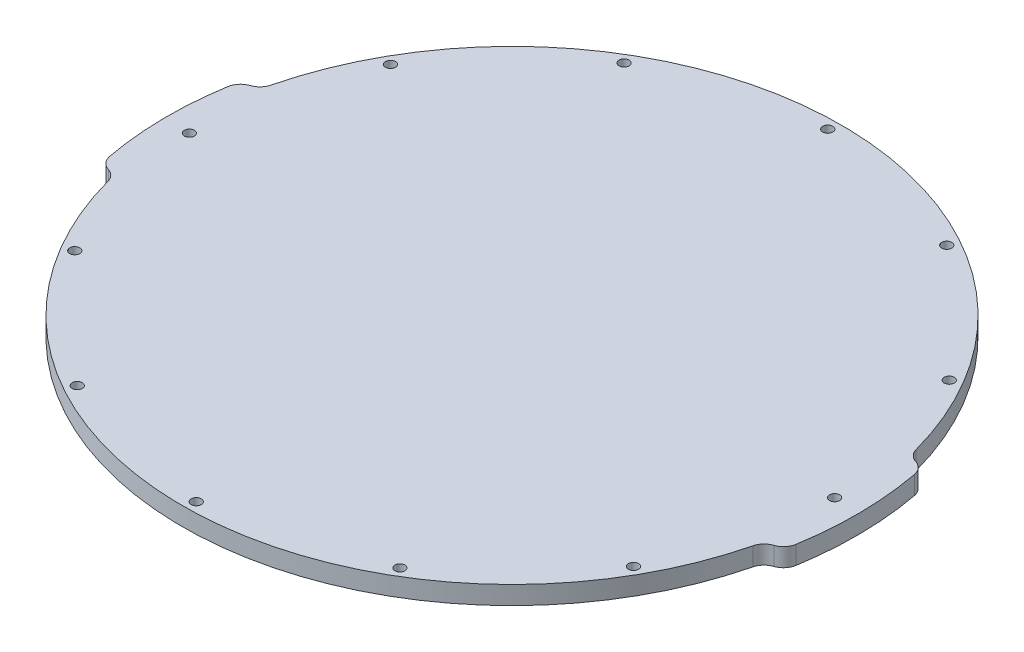
ISO-10303-21;
HEADER;
FILE_DESCRIPTION(('STEP AP214'),'2;1');
FILE_NAME('part.step','',(''),(''),'','','');
FILE_SCHEMA(('AUTOMOTIVE_DESIGN { 1 0 10303 214 1 1 1 1 }'));
ENDSEC;
DATA;
#1=APPLICATION_CONTEXT('core data for automotive mechanical design processes');
#2=APPLICATION_PROTOCOL_DEFINITION('international standard','automotive_design',2000,#1);
#3=PRODUCT_CONTEXT('',#1,'mechanical');
#4=PRODUCT('Part','Part','',(#3));
#5=PRODUCT_RELATED_PRODUCT_CATEGORY('part','',(#4));
#6=PRODUCT_DEFINITION_FORMATION('','',#4);
#7=PRODUCT_DEFINITION_CONTEXT('part definition',#1,'design');
#8=PRODUCT_DEFINITION('design','',#6,#7);
#9=PRODUCT_DEFINITION_SHAPE('','',#8);
#10=(LENGTH_UNIT() NAMED_UNIT(*) SI_UNIT(.MILLI.,.METRE.));
#11=(NAMED_UNIT(*) PLANE_ANGLE_UNIT() SI_UNIT($,.RADIAN.));
#12=(NAMED_UNIT(*) SI_UNIT($,.STERADIAN.) SOLID_ANGLE_UNIT());
#13=UNCERTAINTY_MEASURE_WITH_UNIT(LENGTH_MEASURE(1.E-05),#10,'distance_accuracy_value','');
#14=(GEOMETRIC_REPRESENTATION_CONTEXT(3) GLOBAL_UNCERTAINTY_ASSIGNED_CONTEXT((#13)) GLOBAL_UNIT_ASSIGNED_CONTEXT((#10,
#11,#12)) REPRESENTATION_CONTEXT('',''));
#15=CARTESIAN_POINT('',(0.,0.,0.));
#16=DIRECTION('',(0.,0.,1.));
#17=DIRECTION('',(1.,0.,0.));
#18=AXIS2_PLACEMENT_3D('',#15,#16,#17);
#19=CARTESIAN_POINT('',(-53.253073700487,310.45,-8.79833884608228));
#20=DIRECTION('',(0.,-1.,0.));
#21=DIRECTION('',(-0.0107943843261147,0.,-0.999941738936334));
#22=AXIS2_PLACEMENT_3D('',#19,#20,#21);
#23=PLANE('',#22);
#24=CARTESIAN_POINT('',(-91.1019572773887,310.45,-51.294598938181));
#25=DIRECTION('',(0.,1.,0.));
#26=DIRECTION('',(0.0107943843261147,0.,0.999941738936334));
#27=AXIS2_PLACEMENT_3D('',#24,#25,#26);
#28=CIRCLE('',#27,1.65000000000126);
#29=CARTESIAN_POINT('',(-91.0841465432506,310.45,-49.6446950689347));
#30=VERTEX_POINT('',#29);
#31=EDGE_CURVE('E358',#30,#30,#28,.T.);
#32=ORIENTED_EDGE('',*,*,#31,.F.);
#33=EDGE_LOOP('',(#32));
#34=FACE_BOUND('',#33,.T.);
#35=CARTESIAN_POINT('',(-89.9734043960933,310.45,53.2493098676128));
#36=DIRECTION('',(0.,1.,0.));
#37=DIRECTION('',(0.0107943843261147,0.,0.999941738936334));
#38=AXIS2_PLACEMENT_3D('',#35,#36,#37);
#39=CIRCLE('',#38,1.65000000000101);
#40=CARTESIAN_POINT('',(-89.9555936619552,310.45,54.8992137368587));
#41=VERTEX_POINT('',#40);
#42=EDGE_CURVE('E346',#41,#41,#39,.T.);
#43=ORIENTED_EDGE('',*,*,#42,.F.);
#44=EDGE_LOOP('',(#43));
#45=FACE_BOUND('',#44,.T.);
#46=CARTESIAN_POINT('',(1.12855288129535,310.45,104.543908805794));
#47=DIRECTION('',(0.,1.,0.));
#48=DIRECTION('',(0.0107943843261147,0.,0.999941738936334));
#49=AXIS2_PLACEMENT_3D('',#46,#47,#48);
#50=CIRCLE('',#49,1.65000000000074);
#51=CARTESIAN_POINT('',(1.14636361543345,310.45,106.193812675039));
#52=VERTEX_POINT('',#51);
#53=EDGE_CURVE('E334',#52,#52,#50,.T.);
#54=ORIENTED_EDGE('',*,*,#53,.F.);
#55=EDGE_LOOP('',(#54));
#56=FACE_BOUND('',#55,.T.);
#57=CARTESIAN_POINT('',(91.1019572773888,310.45,51.294598938181));
#58=DIRECTION('',(0.,1.,0.));
#59=DIRECTION('',(0.0107943843261147,0.,0.999941738936334));
#60=AXIS2_PLACEMENT_3D('',#57,#58,#59);
#61=CIRCLE('',#60,1.65000000000052);
#62=CARTESIAN_POINT('',(91.1197680115269,310.45,52.9445028074265));
#63=VERTEX_POINT('',#62);
#64=EDGE_CURVE('E322',#63,#63,#61,.T.);
#65=ORIENTED_EDGE('',*,*,#64,.F.);
#66=EDGE_LOOP('',(#65));
#67=FACE_BOUND('',#66,.T.);
#68=CARTESIAN_POINT('',(89.9734043960934,310.45,-53.2493098676128));
#69=DIRECTION('',(0.,1.,0.));
#70=DIRECTION('',(0.0107943843261147,0.,0.999941738936334));
#71=AXIS2_PLACEMENT_3D('',#68,#69,#70);
#72=CIRCLE('',#71,1.65000000000024);
#73=CARTESIAN_POINT('',(89.9912151302315,310.45,-51.5994059983676));
#74=VERTEX_POINT('',#73);
#75=EDGE_CURVE('E310',#74,#74,#72,.T.);
#76=ORIENTED_EDGE('',*,*,#75,.F.);
#77=EDGE_LOOP('',(#76));
#78=FACE_BOUND('',#77,.T.);
#79=CARTESIAN_POINT('',(-1.12855288129528,310.45,-104.543908805794));
#80=DIRECTION('',(0.,1.,0.));
#81=DIRECTION('',(0.0107943843261147,0.,0.999941738936334));
#82=AXIS2_PLACEMENT_3D('',#79,#80,#81);
#83=CIRCLE('',#82,1.65);
#84=CARTESIAN_POINT('',(-1.11074214715719,310.45,-102.894004936549));
#85=VERTEX_POINT('',#84);
#86=EDGE_CURVE('E278',#85,#85,#83,.T.);
#87=ORIENTED_EDGE('',*,*,#86,.F.);
#88=EDGE_LOOP('',(#87));
#89=FACE_BOUND('',#88,.T.);
#90=CARTESIAN_POINT('',(0.,310.45,0.));
#91=DIRECTION('',(0.,1.,0.));
#92=DIRECTION('',(-0.0107943843261147,0.,-0.999941738936334));
#93=AXIS2_PLACEMENT_3D('',#90,#91,#92);
#94=CIRCLE('',#93,107.95);
#95=CARTESIAN_POINT('',(104.216248329883,310.45,-28.1456228221062));
#96=VERTEX_POINT('',#95);
#97=CARTESIAN_POINT('',(-104.799555978008,310.45,-25.8892944440835));
#98=VERTEX_POINT('',#97);
#99=EDGE_CURVE('E273',#96,#98,#94,.T.);
#100=ORIENTED_EDGE('',*,*,#99,.T.);
#101=CARTESIAN_POINT('',(-109.653634531875,310.45,-27.0884280450137));
#102=DIRECTION('',(0.,-1.,0.));
#103=DIRECTION('',(-0.0107943843261147,0.,-0.999941738936334));
#104=AXIS2_PLACEMENT_3D('',#101,#102,#103);
#105=CIRCLE('',#104,5.);
#106=CARTESIAN_POINT('',(-108.079890966425,310.45,-22.3425528685892));
#107=VERTEX_POINT('',#106);
#108=EDGE_CURVE('E129',#98,#107,#105,.T.);
#109=ORIENTED_EDGE('',*,*,#108,.T.);
#110=CARTESIAN_POINT('',(-106.506147400974,310.45,-17.5966776921645));
#111=DIRECTION('',(0.,1.,0.));
#112=DIRECTION('',(-0.0107943843261147,0.,-0.999941738936334));
#113=AXIS2_PLACEMENT_3D('',#110,#111,#112);
#114=CIRCLE('',#113,5.00000000000021);
#115=CARTESIAN_POINT('',(-111.439271412136,310.45,-18.4117160289947));
#116=VERTEX_POINT('',#115);
#117=EDGE_CURVE('E122',#107,#116,#114,.T.);
#118=ORIENTED_EDGE('',*,*,#117,.T.);
#119=CARTESIAN_POINT('',(0.,310.45,0.));
#120=DIRECTION('',(0.,1.,0.));
#121=DIRECTION('',(-0.0107943843261147,0.,-0.999941738936334));
#122=AXIS2_PLACEMENT_3D('',#119,#120,#121);
#123=CIRCLE('',#122,112.95);
#124=CARTESIAN_POINT('',(-111.01583876685,310.45,20.8131218920348));
#125=VERTEX_POINT('',#124);
#126=EDGE_CURVE('E126',#116,#125,#123,.T.);
#127=ORIENTED_EDGE('',*,*,#126,.T.);
#128=CARTESIAN_POINT('',(-106.101459007362,310.45,19.8917796214711));
#129=DIRECTION('',(0.,1.,0.));
#130=DIRECTION('',(0.0107943843261147,0.,0.999941738936334));
#131=AXIS2_PLACEMENT_3D('',#128,#129,#130);
#132=CIRCLE('',#131,5.00000000000001);
#133=CARTESIAN_POINT('',(-107.572384199652,310.45,24.6705220374928));
#134=VERTEX_POINT('',#133);
#135=EDGE_CURVE('E142',#125,#134,#132,.T.);
#136=ORIENTED_EDGE('',*,*,#135,.T.);
#137=CARTESIAN_POINT('',(-109.043309391943,310.45,29.4492644535144));
#138=DIRECTION('',(0.,-1.,0.));
#139=DIRECTION('',(-0.0107943843261147,0.,-0.999941738936334));
#140=AXIS2_PLACEMENT_3D('',#137,#138,#139);
#141=CIRCLE('',#140,5.);
#142=CARTESIAN_POINT('',(-104.216248329883,310.45,28.1456228221061));
#143=VERTEX_POINT('',#142);
#144=EDGE_CURVE('E11',#134,#143,#141,.T.);
#145=ORIENTED_EDGE('',*,*,#144,.T.);
#146=CARTESIAN_POINT('',(0.,310.45,-5.06423490234011E-13));
#147=DIRECTION('',(0.,1.,0.));
#148=DIRECTION('',(-0.0107943843261147,0.,-0.999941738936334));
#149=AXIS2_PLACEMENT_3D('',#146,#147,#148);
#150=CIRCLE('',#149,107.95);
#151=CARTESIAN_POINT('',(104.799555978008,310.45,25.8892944440835));
#152=VERTEX_POINT('',#151);
#153=EDGE_CURVE('E260',#143,#152,#150,.T.);
#154=ORIENTED_EDGE('',*,*,#153,.T.);
#155=CARTESIAN_POINT('',(109.653634531875,310.45,27.0884280450138));
#156=DIRECTION('',(0.,-1.,0.));
#157=DIRECTION('',(-0.0107943843261147,0.,-0.999941738936334));
#158=AXIS2_PLACEMENT_3D('',#155,#156,#157);
#159=CIRCLE('',#158,5.);
#160=CARTESIAN_POINT('',(108.079890966425,310.45,22.3425528685892));
#161=VERTEX_POINT('',#160);
#162=EDGE_CURVE('E173',#152,#161,#159,.T.);
#163=ORIENTED_EDGE('',*,*,#162,.T.);
#164=CARTESIAN_POINT('',(106.506147400974,310.45,17.5966776921646));
#165=DIRECTION('',(0.,1.,0.));
#166=DIRECTION('',(-0.0107943843261147,0.,-0.999941738936334));
#167=AXIS2_PLACEMENT_3D('',#164,#165,#166);
#168=CIRCLE('',#167,5.00000000000002);
#169=CARTESIAN_POINT('',(111.439271412136,310.45,18.4117160289948));
#170=VERTEX_POINT('',#169);
#171=EDGE_CURVE('E257',#161,#170,#168,.T.);
#172=ORIENTED_EDGE('',*,*,#171,.T.);
#173=CARTESIAN_POINT('',(-1.27964959012173E-12,310.45,0.));
#174=DIRECTION('',(0.,1.,0.));
#175=DIRECTION('',(0.0107943843261147,0.,0.999941738936334));
#176=AXIS2_PLACEMENT_3D('',#173,#174,#175);
#177=CIRCLE('',#176,112.950000000001);
#178=CARTESIAN_POINT('',(111.01583876685,310.45,-20.8131218920348));
#179=VERTEX_POINT('',#178);
#180=EDGE_CURVE('E264',#170,#179,#177,.T.);
#181=ORIENTED_EDGE('',*,*,#180,.T.);
#182=CARTESIAN_POINT('',(106.101459007362,310.45,-19.8917796214711));
#183=DIRECTION('',(0.,1.,0.));
#184=DIRECTION('',(0.0107943843261147,0.,0.999941738936334));
#185=AXIS2_PLACEMENT_3D('',#182,#183,#184);
#186=CIRCLE('',#185,5.);
#187=CARTESIAN_POINT('',(107.572384199652,310.45,-24.6705220374928));
#188=VERTEX_POINT('',#187);
#189=EDGE_CURVE('E266',#179,#188,#186,.T.);
#190=ORIENTED_EDGE('',*,*,#189,.T.);
#191=CARTESIAN_POINT('',(109.043309391943,310.45,-29.4492644535145));
#192=DIRECTION('',(0.,-1.,0.));
#193=DIRECTION('',(-0.0107943843261147,0.,-0.999941738936334));
#194=AXIS2_PLACEMENT_3D('',#191,#192,#193);
#195=CIRCLE('',#194,5.);
#196=EDGE_CURVE('E177',#188,#96,#195,.T.);
#197=ORIENTED_EDGE('',*,*,#196,.T.);
#198=EDGE_LOOP('',(#100,#109,#118,#127,#136,#145,#154,#163,#172,#181,#190,#197));
#199=FACE_BOUND('',#198,.T.);
#200=CARTESIAN_POINT('',(51.2945989381811,310.45,-91.1019572773887));
#201=DIRECTION('',(0.,1.,0.));
#202=DIRECTION('',(0.0107943843261147,0.,0.999941738936334));
#203=AXIS2_PLACEMENT_3D('',#200,#201,#202);
#204=CIRCLE('',#203,1.65000000000009);
#205=CARTESIAN_POINT('',(51.3124096723192,310.45,-89.4520534081437));
#206=VERTEX_POINT('',#205);
#207=EDGE_CURVE('E304',#206,#206,#204,.T.);
#208=ORIENTED_EDGE('',*,*,#207,.F.);
#209=EDGE_LOOP('',(#208));
#210=FACE_BOUND('',#209,.T.);
#211=CARTESIAN_POINT('',(104.543908805794,310.45,-1.12855288129533));
#212=DIRECTION('',(0.,1.,0.));
#213=DIRECTION('',(0.0107943843261147,0.,0.999941738936334));
#214=AXIS2_PLACEMENT_3D('',#211,#212,#213);
#215=CIRCLE('',#214,1.65000000000037);
#216=CARTESIAN_POINT('',(104.561719539932,310.45,0.521350987949993));
#217=VERTEX_POINT('',#216);
#218=EDGE_CURVE('E316',#217,#217,#215,.T.);
#219=ORIENTED_EDGE('',*,*,#218,.F.);
#220=EDGE_LOOP('',(#219));
#221=FACE_BOUND('',#220,.T.);
#222=CARTESIAN_POINT('',(53.2493098676128,310.45,89.9734043960934));
#223=DIRECTION('',(0.,1.,0.));
#224=DIRECTION('',(0.0107943843261147,0.,0.999941738936334));
#225=AXIS2_PLACEMENT_3D('',#222,#223,#224);
#226=CIRCLE('',#225,1.65000000000066);
#227=CARTESIAN_POINT('',(53.2671206017509,310.45,91.623308265339));
#228=VERTEX_POINT('',#227);
#229=EDGE_CURVE('E328',#228,#228,#226,.T.);
#230=ORIENTED_EDGE('',*,*,#229,.F.);
#231=EDGE_LOOP('',(#230));
#232=FACE_BOUND('',#231,.T.);
#233=CARTESIAN_POINT('',(-51.294598938181,310.45,91.1019572773887));
#234=DIRECTION('',(0.,1.,0.));
#235=DIRECTION('',(0.0107943843261147,0.,0.999941738936334));
#236=AXIS2_PLACEMENT_3D('',#233,#234,#235);
#237=CIRCLE('',#236,1.65000000000089);
#238=CARTESIAN_POINT('',(-51.2767882040429,310.45,92.7518611466346));
#239=VERTEX_POINT('',#238);
#240=EDGE_CURVE('E340',#239,#239,#237,.T.);
#241=ORIENTED_EDGE('',*,*,#240,.F.);
#242=EDGE_LOOP('',(#241));
#243=FACE_BOUND('',#242,.T.);
#244=CARTESIAN_POINT('',(-104.543908805794,310.45,1.12855288129531));
#245=DIRECTION('',(0.,1.,0.));
#246=DIRECTION('',(0.0107943843261147,0.,0.999941738936334));
#247=AXIS2_PLACEMENT_3D('',#244,#245,#246);
#248=CIRCLE('',#247,1.65000000000109);
#249=CARTESIAN_POINT('',(-104.526098071656,310.45,2.77845675054135));
#250=VERTEX_POINT('',#249);
#251=EDGE_CURVE('E352',#250,#250,#248,.T.);
#252=ORIENTED_EDGE('',*,*,#251,.F.);
#253=EDGE_LOOP('',(#252));
#254=FACE_BOUND('',#253,.T.);
#255=CARTESIAN_POINT('',(-53.2493098676128,310.45,-89.9734043960934));
#256=DIRECTION('',(0.,1.,0.));
#257=DIRECTION('',(0.0107943843261147,0.,0.999941738936334));
#258=AXIS2_PLACEMENT_3D('',#255,#256,#257);
#259=CIRCLE('',#258,1.65000000000134);
#260=CARTESIAN_POINT('',(-53.2314991334746,310.45,-88.3235005268471));
#261=VERTEX_POINT('',#260);
#262=EDGE_CURVE('E364',#261,#261,#259,.T.);
#263=ORIENTED_EDGE('',*,*,#262,.F.);
#264=EDGE_LOOP('',(#263));
#265=FACE_BOUND('',#264,.T.);
#266=ADVANCED_FACE('F34',(#34,#45,#56,#67,#78,#89,#199,#210,#221,#232,#243,#254,#265),#23,.F.);
#267=CARTESIAN_POINT('',(-53.253073700487,304.45,-8.79833884608228));
#268=DIRECTION('',(0.,-1.,0.));
#269=DIRECTION('',(-0.0107943843261147,0.,-0.999941738936334));
#270=AXIS2_PLACEMENT_3D('',#267,#268,#269);
#271=PLANE('',#270);
#272=CARTESIAN_POINT('',(-91.1019572773887,304.45,-51.294598938181));
#273=DIRECTION('',(0.,1.,0.));
#274=DIRECTION('',(0.0107943843261147,0.,0.999941738936334));
#275=AXIS2_PLACEMENT_3D('',#272,#273,#274);
#276=CIRCLE('',#275,1.65000000000126);
#277=CARTESIAN_POINT('',(-91.0841465432506,304.45,-49.6446950689347));
#278=VERTEX_POINT('',#277);
#279=EDGE_CURVE('E361',#278,#278,#276,.T.);
#280=ORIENTED_EDGE('',*,*,#279,.T.);
#281=EDGE_LOOP('',(#280));
#282=FACE_BOUND('',#281,.T.);
#283=CARTESIAN_POINT('',(-89.9734043960933,304.45,53.2493098676128));
#284=DIRECTION('',(0.,1.,0.));
#285=DIRECTION('',(0.0107943843261147,0.,0.999941738936334));
#286=AXIS2_PLACEMENT_3D('',#283,#284,#285);
#287=CIRCLE('',#286,1.65000000000101);
#288=CARTESIAN_POINT('',(-89.9555936619552,304.45,54.8992137368587));
#289=VERTEX_POINT('',#288);
#290=EDGE_CURVE('E349',#289,#289,#287,.T.);
#291=ORIENTED_EDGE('',*,*,#290,.T.);
#292=EDGE_LOOP('',(#291));
#293=FACE_BOUND('',#292,.T.);
#294=CARTESIAN_POINT('',(1.12855288129535,304.45,104.543908805794));
#295=DIRECTION('',(0.,1.,0.));
#296=DIRECTION('',(0.0107943843261147,0.,0.999941738936334));
#297=AXIS2_PLACEMENT_3D('',#294,#295,#296);
#298=CIRCLE('',#297,1.65000000000074);
#299=CARTESIAN_POINT('',(1.14636361543345,304.45,106.193812675039));
#300=VERTEX_POINT('',#299);
#301=EDGE_CURVE('E337',#300,#300,#298,.T.);
#302=ORIENTED_EDGE('',*,*,#301,.T.);
#303=EDGE_LOOP('',(#302));
#304=FACE_BOUND('',#303,.T.);
#305=CARTESIAN_POINT('',(91.1019572773888,304.45,51.294598938181));
#306=DIRECTION('',(0.,1.,0.));
#307=DIRECTION('',(0.0107943843261147,0.,0.999941738936334));
#308=AXIS2_PLACEMENT_3D('',#305,#306,#307);
#309=CIRCLE('',#308,1.65000000000052);
#310=CARTESIAN_POINT('',(91.1197680115269,304.45,52.9445028074265));
#311=VERTEX_POINT('',#310);
#312=EDGE_CURVE('E325',#311,#311,#309,.T.);
#313=ORIENTED_EDGE('',*,*,#312,.T.);
#314=EDGE_LOOP('',(#313));
#315=FACE_BOUND('',#314,.T.);
#316=CARTESIAN_POINT('',(89.9734043960934,304.45,-53.2493098676128));
#317=DIRECTION('',(0.,1.,0.));
#318=DIRECTION('',(0.0107943843261147,0.,0.999941738936334));
#319=AXIS2_PLACEMENT_3D('',#316,#317,#318);
#320=CIRCLE('',#319,1.65000000000024);
#321=CARTESIAN_POINT('',(89.9912151302315,304.45,-51.5994059983676));
#322=VERTEX_POINT('',#321);
#323=EDGE_CURVE('E313',#322,#322,#320,.T.);
#324=ORIENTED_EDGE('',*,*,#323,.T.);
#325=EDGE_LOOP('',(#324));
#326=FACE_BOUND('',#325,.T.);
#327=CARTESIAN_POINT('',(-1.12855288129528,304.45,-104.543908805794));
#328=DIRECTION('',(0.,1.,0.));
#329=DIRECTION('',(0.0107943843261147,0.,0.999941738936334));
#330=AXIS2_PLACEMENT_3D('',#327,#328,#329);
#331=CIRCLE('',#330,1.65);
#332=CARTESIAN_POINT('',(-1.11074214715719,304.45,-102.894004936549));
#333=VERTEX_POINT('',#332);
#334=EDGE_CURVE('E301',#333,#333,#331,.T.);
#335=ORIENTED_EDGE('',*,*,#334,.T.);
#336=EDGE_LOOP('',(#335));
#337=FACE_BOUND('',#336,.T.);
#338=CARTESIAN_POINT('',(-106.506147400974,304.45,-17.5966776921645));
#339=DIRECTION('',(0.,1.,0.));
#340=DIRECTION('',(-0.0107943843261147,0.,-0.999941738936334));
#341=AXIS2_PLACEMENT_3D('',#338,#339,#340);
#342=CIRCLE('',#341,5.00000000000021);
#343=CARTESIAN_POINT('',(-108.079890966425,304.45,-22.3425528685892));
#344=VERTEX_POINT('',#343);
#345=CARTESIAN_POINT('',(-111.439271412136,304.45,-18.4117160289947));
#346=VERTEX_POINT('',#345);
#347=EDGE_CURVE('E146',#344,#346,#342,.T.);
#348=ORIENTED_EDGE('',*,*,#347,.F.);
#349=CARTESIAN_POINT('',(-109.653634531875,304.45,-27.0884280450137));
#350=DIRECTION('',(0.,-1.,0.));
#351=DIRECTION('',(-0.0107943843261147,0.,-0.999941738936334));
#352=AXIS2_PLACEMENT_3D('',#349,#350,#351);
#353=CIRCLE('',#352,5.);
#354=CARTESIAN_POINT('',(-104.799555978008,304.45,-25.8892944440835));
#355=VERTEX_POINT('',#354);
#356=EDGE_CURVE('E179',#344,#355,#353,.F.);
#357=ORIENTED_EDGE('',*,*,#356,.T.);
#358=CARTESIAN_POINT('',(0.,304.45,0.));
#359=DIRECTION('',(0.,1.,0.));
#360=DIRECTION('',(-0.0107943843261147,0.,-0.999941738936334));
#361=AXIS2_PLACEMENT_3D('',#358,#359,#360);
#362=CIRCLE('',#361,107.95);
#363=CARTESIAN_POINT('',(104.216248329883,304.45,-28.1456228221062));
#364=VERTEX_POINT('',#363);
#365=EDGE_CURVE('E134',#364,#355,#362,.T.);
#366=ORIENTED_EDGE('',*,*,#365,.F.);
#367=CARTESIAN_POINT('',(109.043309391943,304.45,-29.4492644535145));
#368=DIRECTION('',(0.,-1.,0.));
#369=DIRECTION('',(-0.0107943843261147,0.,-0.999941738936334));
#370=AXIS2_PLACEMENT_3D('',#367,#368,#369);
#371=CIRCLE('',#370,5.);
#372=CARTESIAN_POINT('',(107.572384199652,304.45,-24.6705220374928));
#373=VERTEX_POINT('',#372);
#374=EDGE_CURVE('E175',#364,#373,#371,.F.);
#375=ORIENTED_EDGE('',*,*,#374,.T.);
#376=CARTESIAN_POINT('',(106.101459007362,304.45,-19.8917796214711));
#377=DIRECTION('',(0.,1.,0.));
#378=DIRECTION('',(0.0107943843261147,0.,0.999941738936334));
#379=AXIS2_PLACEMENT_3D('',#376,#377,#378);
#380=CIRCLE('',#379,5.);
#381=CARTESIAN_POINT('',(111.01583876685,304.45,-20.8131218920348));
#382=VERTEX_POINT('',#381);
#383=EDGE_CURVE('E191',#382,#373,#380,.T.);
#384=ORIENTED_EDGE('',*,*,#383,.F.);
#385=CARTESIAN_POINT('',(-1.27964959012173E-12,304.45,0.));
#386=DIRECTION('',(0.,1.,0.));
#387=DIRECTION('',(0.0107943843261147,0.,0.999941738936334));
#388=AXIS2_PLACEMENT_3D('',#385,#386,#387);
#389=CIRCLE('',#388,112.950000000001);
#390=CARTESIAN_POINT('',(111.439271412136,304.45,18.4117160289948));
#391=VERTEX_POINT('',#390);
#392=EDGE_CURVE('E287',#391,#382,#389,.T.);
#393=ORIENTED_EDGE('',*,*,#392,.F.);
#394=CARTESIAN_POINT('',(106.506147400974,304.45,17.5966776921646));
#395=DIRECTION('',(0.,1.,0.));
#396=DIRECTION('',(-0.0107943843261147,0.,-0.999941738936334));
#397=AXIS2_PLACEMENT_3D('',#394,#395,#396);
#398=CIRCLE('',#397,5.00000000000002);
#399=CARTESIAN_POINT('',(108.079890966425,304.45,22.3425528685892));
#400=VERTEX_POINT('',#399);
#401=EDGE_CURVE('E285',#400,#391,#398,.T.);
#402=ORIENTED_EDGE('',*,*,#401,.F.);
#403=CARTESIAN_POINT('',(109.653634531875,304.45,27.0884280450138));
#404=DIRECTION('',(0.,-1.,0.));
#405=DIRECTION('',(-0.0107943843261147,0.,-0.999941738936334));
#406=AXIS2_PLACEMENT_3D('',#403,#404,#405);
#407=CIRCLE('',#406,5.);
#408=CARTESIAN_POINT('',(104.799555978008,304.45,25.8892944440835));
#409=VERTEX_POINT('',#408);
#410=EDGE_CURVE('E171',#400,#409,#407,.F.);
#411=ORIENTED_EDGE('',*,*,#410,.T.);
#412=CARTESIAN_POINT('',(0.,304.45,-5.06423490234011E-13));
#413=DIRECTION('',(0.,1.,0.));
#414=DIRECTION('',(-0.0107943843261147,0.,-0.999941738936334));
#415=AXIS2_PLACEMENT_3D('',#412,#413,#414);
#416=CIRCLE('',#415,107.95);
#417=CARTESIAN_POINT('',(-104.216248329883,304.45,28.1456228221061));
#418=VERTEX_POINT('',#417);
#419=EDGE_CURVE('E282',#418,#409,#416,.T.);
#420=ORIENTED_EDGE('',*,*,#419,.F.);
#421=CARTESIAN_POINT('',(-109.043309391943,304.45,29.4492644535144));
#422=DIRECTION('',(0.,-1.,0.));
#423=DIRECTION('',(-0.0107943843261147,0.,-0.999941738936334));
#424=AXIS2_PLACEMENT_3D('',#421,#422,#423);
#425=CIRCLE('',#424,5.);
#426=CARTESIAN_POINT('',(-107.572384199652,304.45,24.6705220374928));
#427=VERTEX_POINT('',#426);
#428=EDGE_CURVE('E42',#418,#427,#425,.F.);
#429=ORIENTED_EDGE('',*,*,#428,.T.);
#430=CARTESIAN_POINT('',(-106.101459007362,304.45,19.8917796214711));
#431=DIRECTION('',(0.,1.,0.));
#432=DIRECTION('',(0.0107943843261147,0.,0.999941738936334));
#433=AXIS2_PLACEMENT_3D('',#430,#431,#432);
#434=CIRCLE('',#433,5.00000000000001);
#435=CARTESIAN_POINT('',(-111.01583876685,304.45,20.8131218920348));
#436=VERTEX_POINT('',#435);
#437=EDGE_CURVE('E280',#436,#427,#434,.T.);
#438=ORIENTED_EDGE('',*,*,#437,.F.);
#439=CARTESIAN_POINT('',(0.,304.45,0.));
#440=DIRECTION('',(0.,1.,0.));
#441=DIRECTION('',(-0.0107943843261147,0.,-0.999941738936334));
#442=AXIS2_PLACEMENT_3D('',#439,#440,#441);
#443=CIRCLE('',#442,112.95);
#444=EDGE_CURVE('E277',#346,#436,#443,.T.);
#445=ORIENTED_EDGE('',*,*,#444,.F.);
#446=EDGE_LOOP('',(#348,#357,#366,#375,#384,#393,#402,#411,#420,#429,#438,#445));
#447=FACE_BOUND('',#446,.T.);
#448=CARTESIAN_POINT('',(51.2945989381811,304.45,-91.1019572773887));
#449=DIRECTION('',(0.,1.,0.));
#450=DIRECTION('',(0.0107943843261147,0.,0.999941738936334));
#451=AXIS2_PLACEMENT_3D('',#448,#449,#450);
#452=CIRCLE('',#451,1.65000000000009);
#453=CARTESIAN_POINT('',(51.3124096723192,304.45,-89.4520534081437));
#454=VERTEX_POINT('',#453);
#455=EDGE_CURVE('E307',#454,#454,#452,.T.);
#456=ORIENTED_EDGE('',*,*,#455,.T.);
#457=EDGE_LOOP('',(#456));
#458=FACE_BOUND('',#457,.T.);
#459=CARTESIAN_POINT('',(104.543908805794,304.45,-1.12855288129533));
#460=DIRECTION('',(0.,1.,0.));
#461=DIRECTION('',(0.0107943843261147,0.,0.999941738936334));
#462=AXIS2_PLACEMENT_3D('',#459,#460,#461);
#463=CIRCLE('',#462,1.65000000000037);
#464=CARTESIAN_POINT('',(104.561719539932,304.45,0.521350987949993));
#465=VERTEX_POINT('',#464);
#466=EDGE_CURVE('E319',#465,#465,#463,.T.);
#467=ORIENTED_EDGE('',*,*,#466,.T.);
#468=EDGE_LOOP('',(#467));
#469=FACE_BOUND('',#468,.T.);
#470=CARTESIAN_POINT('',(53.2493098676128,304.45,89.9734043960934));
#471=DIRECTION('',(0.,1.,0.));
#472=DIRECTION('',(0.0107943843261147,0.,0.999941738936334));
#473=AXIS2_PLACEMENT_3D('',#470,#471,#472);
#474=CIRCLE('',#473,1.65000000000066);
#475=CARTESIAN_POINT('',(53.2671206017509,304.45,91.623308265339));
#476=VERTEX_POINT('',#475);
#477=EDGE_CURVE('E331',#476,#476,#474,.T.);
#478=ORIENTED_EDGE('',*,*,#477,.T.);
#479=EDGE_LOOP('',(#478));
#480=FACE_BOUND('',#479,.T.);
#481=CARTESIAN_POINT('',(-51.294598938181,304.45,91.1019572773887));
#482=DIRECTION('',(0.,1.,0.));
#483=DIRECTION('',(0.0107943843261147,0.,0.999941738936334));
#484=AXIS2_PLACEMENT_3D('',#481,#482,#483);
#485=CIRCLE('',#484,1.65000000000089);
#486=CARTESIAN_POINT('',(-51.2767882040429,304.45,92.7518611466346));
#487=VERTEX_POINT('',#486);
#488=EDGE_CURVE('E343',#487,#487,#485,.T.);
#489=ORIENTED_EDGE('',*,*,#488,.T.);
#490=EDGE_LOOP('',(#489));
#491=FACE_BOUND('',#490,.T.);
#492=CARTESIAN_POINT('',(-104.543908805794,304.45,1.12855288129531));
#493=DIRECTION('',(0.,1.,0.));
#494=DIRECTION('',(0.0107943843261147,0.,0.999941738936334));
#495=AXIS2_PLACEMENT_3D('',#492,#493,#494);
#496=CIRCLE('',#495,1.65000000000109);
#497=CARTESIAN_POINT('',(-104.526098071656,304.45,2.77845675054135));
#498=VERTEX_POINT('',#497);
#499=EDGE_CURVE('E355',#498,#498,#496,.T.);
#500=ORIENTED_EDGE('',*,*,#499,.T.);
#501=EDGE_LOOP('',(#500));
#502=FACE_BOUND('',#501,.T.);
#503=CARTESIAN_POINT('',(-53.2493098676128,304.45,-89.9734043960934));
#504=DIRECTION('',(0.,1.,0.));
#505=DIRECTION('',(0.0107943843261147,0.,0.999941738936334));
#506=AXIS2_PLACEMENT_3D('',#503,#504,#505);
#507=CIRCLE('',#506,1.65000000000134);
#508=CARTESIAN_POINT('',(-53.2314991334746,304.45,-88.3235005268471));
#509=VERTEX_POINT('',#508);
#510=EDGE_CURVE('E367',#509,#509,#507,.T.);
#511=ORIENTED_EDGE('',*,*,#510,.T.);
#512=EDGE_LOOP('',(#511));
#513=FACE_BOUND('',#512,.T.);
#514=ADVANCED_FACE('F183',(#282,#293,#304,#315,#326,#337,#447,#458,#469,#480,#491,#502,#513),
#271,.T.);
#515=CARTESIAN_POINT('',(-106.506147400974,310.45,-17.5966776921645));
#516=DIRECTION('',(0.,-1.,0.));
#517=DIRECTION('',(-0.0107943843261147,0.,-0.999941738936334));
#518=AXIS2_PLACEMENT_3D('',#515,#516,#517);
#519=CYLINDRICAL_SURFACE('',#518,5.00000000000021);
#520=ORIENTED_EDGE('',*,*,#117,.F.);
#521=DIRECTION('',(0.,-1.,0.));
#522=VECTOR('',#521,1.);
#523=CARTESIAN_POINT('',(-108.079890966425,310.45,-22.3425528685892));
#524=LINE('',#523,#522);
#525=EDGE_CURVE('E168',#107,#344,#524,.T.);
#526=ORIENTED_EDGE('',*,*,#525,.T.);
#527=ORIENTED_EDGE('',*,*,#347,.T.);
#528=DIRECTION('',(0.,-1.,0.));
#529=VECTOR('',#528,1.);
#530=CARTESIAN_POINT('',(-111.439271412136,310.45,-18.4117160289947));
#531=LINE('',#530,#529);
#532=EDGE_CURVE('E139',#116,#346,#531,.T.);
#533=ORIENTED_EDGE('',*,*,#532,.F.);
#534=EDGE_LOOP('',(#520,#526,#527,#533));
#535=FACE_BOUND('',#534,.T.);
#536=ADVANCED_FACE('F144',(#535),#519,.T.);
#537=CARTESIAN_POINT('',(0.,310.45,0.));
#538=DIRECTION('',(0.,-1.,0.));
#539=DIRECTION('',(-0.0107943843261147,0.,-0.999941738936334));
#540=AXIS2_PLACEMENT_3D('',#537,#538,#539);
#541=CYLINDRICAL_SURFACE('',#540,112.95);
#542=ORIENTED_EDGE('',*,*,#444,.T.);
#543=DIRECTION('',(0.,-1.,0.));
#544=VECTOR('',#543,1.);
#545=CARTESIAN_POINT('',(-111.01583876685,310.45,20.8131218920348));
#546=LINE('',#545,#544);
#547=EDGE_CURVE('E141',#125,#436,#546,.T.);
#548=ORIENTED_EDGE('',*,*,#547,.F.);
#549=ORIENTED_EDGE('',*,*,#126,.F.);
#550=ORIENTED_EDGE('',*,*,#532,.T.);
#551=EDGE_LOOP('',(#542,#548,#549,#550));
#552=FACE_BOUND('',#551,.T.);
#553=ADVANCED_FACE('F138',(#552),#541,.T.);
#554=CARTESIAN_POINT('',(-106.101459007362,310.45,19.8917796214711));
#555=DIRECTION('',(0.,-1.,0.));
#556=DIRECTION('',(-0.0107943843261147,0.,-0.999941738936334));
#557=AXIS2_PLACEMENT_3D('',#554,#555,#556);
#558=CYLINDRICAL_SURFACE('',#557,5.00000000000001);
#559=ORIENTED_EDGE('',*,*,#437,.T.);
#560=DIRECTION('',(0.,-1.,0.));
#561=VECTOR('',#560,1.);
#562=CARTESIAN_POINT('',(-107.572384199652,310.45,24.6705220374928));
#563=LINE('',#562,#561);
#564=EDGE_CURVE('E49',#427,#134,#563,.F.);
#565=ORIENTED_EDGE('',*,*,#564,.T.);
#566=ORIENTED_EDGE('',*,*,#135,.F.);
#567=ORIENTED_EDGE('',*,*,#547,.T.);
#568=EDGE_LOOP('',(#559,#565,#566,#567));
#569=FACE_BOUND('',#568,.T.);
#570=ADVANCED_FACE('F235',(#569),#558,.T.);
#571=CARTESIAN_POINT('',(0.,310.45,-5.06423490234011E-13));
#572=DIRECTION('',(0.,-1.,0.));
#573=DIRECTION('',(-0.0107943843261147,0.,-0.999941738936334));
#574=AXIS2_PLACEMENT_3D('',#571,#572,#573);
#575=CYLINDRICAL_SURFACE('',#574,107.95);
#576=ORIENTED_EDGE('',*,*,#419,.T.);
#577=DIRECTION('',(0.,-1.,0.));
#578=VECTOR('',#577,1.);
#579=CARTESIAN_POINT('',(104.799555978008,310.45,25.8892944440835));
#580=LINE('',#579,#578);
#581=EDGE_CURVE('E159',#409,#152,#580,.F.);
#582=ORIENTED_EDGE('',*,*,#581,.T.);
#583=ORIENTED_EDGE('',*,*,#153,.F.);
#584=DIRECTION('',(0.,-1.,0.));
#585=VECTOR('',#584,1.);
#586=CARTESIAN_POINT('',(-104.216248329883,310.45,28.1456228221061));
#587=LINE('',#586,#585);
#588=EDGE_CURVE('E151',#143,#418,#587,.T.);
#589=ORIENTED_EDGE('',*,*,#588,.T.);
#590=EDGE_LOOP('',(#576,#582,#583,#589));
#591=FACE_BOUND('',#590,.T.);
#592=ADVANCED_FACE('F231',(#591),#575,.T.);
#593=CARTESIAN_POINT('',(106.506147400974,310.45,17.5966776921646));
#594=DIRECTION('',(0.,-1.,0.));
#595=DIRECTION('',(-0.0107943843261147,0.,-0.999941738936334));
#596=AXIS2_PLACEMENT_3D('',#593,#594,#595);
#597=CYLINDRICAL_SURFACE('',#596,5.00000000000002);
#598=ORIENTED_EDGE('',*,*,#171,.F.);
#599=DIRECTION('',(0.,-1.,0.));
#600=VECTOR('',#599,1.);
#601=CARTESIAN_POINT('',(108.079890966425,310.45,22.3425528685892));
#602=LINE('',#601,#600);
#603=EDGE_CURVE('E148',#161,#400,#602,.T.);
#604=ORIENTED_EDGE('',*,*,#603,.T.);
#605=ORIENTED_EDGE('',*,*,#401,.T.);
#606=DIRECTION('',(0.,-1.,0.));
#607=VECTOR('',#606,1.);
#608=CARTESIAN_POINT('',(111.439271412136,310.45,18.4117160289948));
#609=LINE('',#608,#607);
#610=EDGE_CURVE('E153',#170,#391,#609,.T.);
#611=ORIENTED_EDGE('',*,*,#610,.F.);
#612=EDGE_LOOP('',(#598,#604,#605,#611));
#613=FACE_BOUND('',#612,.T.);
#614=ADVANCED_FACE('F227',(#613),#597,.T.);
#615=CARTESIAN_POINT('',(-1.27964959012173E-12,310.45,0.));
#616=DIRECTION('',(0.,-1.,0.));
#617=DIRECTION('',(-0.0107943843261147,0.,-0.999941738936334));
#618=AXIS2_PLACEMENT_3D('',#615,#616,#617);
#619=CYLINDRICAL_SURFACE('',#618,112.950000000001);
#620=ORIENTED_EDGE('',*,*,#392,.T.);
#621=DIRECTION('',(0.,-1.,0.));
#622=VECTOR('',#621,1.);
#623=CARTESIAN_POINT('',(111.01583876685,310.45,-20.8131218920348));
#624=LINE('',#623,#622);
#625=EDGE_CURVE('E275',#179,#382,#624,.T.);
#626=ORIENTED_EDGE('',*,*,#625,.F.);
#627=ORIENTED_EDGE('',*,*,#180,.F.);
#628=ORIENTED_EDGE('',*,*,#610,.T.);
#629=EDGE_LOOP('',(#620,#626,#627,#628));
#630=FACE_BOUND('',#629,.T.);
#631=ADVANCED_FACE('F223',(#630),#619,.T.);
#632=CARTESIAN_POINT('',(106.101459007362,310.45,-19.8917796214711));
#633=DIRECTION('',(0.,-1.,0.));
#634=DIRECTION('',(-0.0107943843261147,0.,-0.999941738936334));
#635=AXIS2_PLACEMENT_3D('',#632,#633,#634);
#636=CYLINDRICAL_SURFACE('',#635,5.);
#637=ORIENTED_EDGE('',*,*,#383,.T.);
#638=DIRECTION('',(0.,-1.,0.));
#639=VECTOR('',#638,1.);
#640=CARTESIAN_POINT('',(107.572384199652,310.45,-24.6705220374928));
#641=LINE('',#640,#639);
#642=EDGE_CURVE('E166',#373,#188,#641,.F.);
#643=ORIENTED_EDGE('',*,*,#642,.T.);
#644=ORIENTED_EDGE('',*,*,#189,.F.);
#645=ORIENTED_EDGE('',*,*,#625,.T.);
#646=EDGE_LOOP('',(#637,#643,#644,#645));
#647=FACE_BOUND('',#646,.T.);
#648=ADVANCED_FACE('F220',(#647),#636,.T.);
#649=CARTESIAN_POINT('',(0.,310.45,0.));
#650=DIRECTION('',(0.,-1.,0.));
#651=DIRECTION('',(-0.0107943843261147,0.,-0.999941738936334));
#652=AXIS2_PLACEMENT_3D('',#649,#650,#651);
#653=CYLINDRICAL_SURFACE('',#652,107.95);
#654=ORIENTED_EDGE('',*,*,#99,.F.);
#655=DIRECTION('',(0.,-1.,0.));
#656=VECTOR('',#655,1.);
#657=CARTESIAN_POINT('',(104.216248329883,310.45,-28.1456228221062));
#658=LINE('',#657,#656);
#659=EDGE_CURVE('E163',#96,#364,#658,.T.);
#660=ORIENTED_EDGE('',*,*,#659,.T.);
#661=ORIENTED_EDGE('',*,*,#365,.T.);
#662=DIRECTION('',(0.,-1.,0.));
#663=VECTOR('',#662,1.);
#664=CARTESIAN_POINT('',(-104.799555978008,310.45,-25.8892944440835));
#665=LINE('',#664,#663);
#666=EDGE_CURVE('E161',#355,#98,#665,.F.);
#667=ORIENTED_EDGE('',*,*,#666,.T.);
#668=EDGE_LOOP('',(#654,#660,#661,#667));
#669=FACE_BOUND('',#668,.T.);
#670=ADVANCED_FACE('F189',(#669),#653,.T.);
#671=CARTESIAN_POINT('',(-1.12855288129528,310.45,-104.543908805794));
#672=DIRECTION('',(0.,-1.,0.));
#673=DIRECTION('',(-0.0107943843261147,0.,-0.999941738936334));
#674=AXIS2_PLACEMENT_3D('',#671,#672,#673);
#675=CYLINDRICAL_SURFACE('',#674,1.65);
#676=ORIENTED_EDGE('',*,*,#86,.T.);
#677=EDGE_LOOP('',(#676));
#678=FACE_BOUND('',#677,.T.);
#679=ORIENTED_EDGE('',*,*,#334,.F.);
#680=EDGE_LOOP('',(#679));
#681=FACE_BOUND('',#680,.T.);
#682=ADVANCED_FACE('F215',(#678,#681),#675,.F.);
#683=CARTESIAN_POINT('',(51.2945989381811,310.45,-91.1019572773887));
#684=DIRECTION('',(0.,-1.,0.));
#685=DIRECTION('',(-0.0107943843261147,0.,-0.999941738936334));
#686=AXIS2_PLACEMENT_3D('',#683,#684,#685);
#687=CYLINDRICAL_SURFACE('',#686,1.65000000000009);
#688=ORIENTED_EDGE('',*,*,#207,.T.);
#689=EDGE_LOOP('',(#688));
#690=FACE_BOUND('',#689,.T.);
#691=ORIENTED_EDGE('',*,*,#455,.F.);
#692=EDGE_LOOP('',(#691));
#693=FACE_BOUND('',#692,.T.);
#694=ADVANCED_FACE('F394',(#690,#693),#687,.F.);
#695=CARTESIAN_POINT('',(89.9734043960934,310.45,-53.2493098676128));
#696=DIRECTION('',(0.,-1.,0.));
#697=DIRECTION('',(-0.0107943843261147,0.,-0.999941738936334));
#698=AXIS2_PLACEMENT_3D('',#695,#696,#697);
#699=CYLINDRICAL_SURFACE('',#698,1.65000000000024);
#700=ORIENTED_EDGE('',*,*,#75,.T.);
#701=EDGE_LOOP('',(#700));
#702=FACE_BOUND('',#701,.T.);
#703=ORIENTED_EDGE('',*,*,#323,.F.);
#704=EDGE_LOOP('',(#703));
#705=FACE_BOUND('',#704,.T.);
#706=ADVANCED_FACE('F399',(#702,#705),#699,.F.);
#707=CARTESIAN_POINT('',(104.543908805794,310.45,-1.12855288129533));
#708=DIRECTION('',(0.,-1.,0.));
#709=DIRECTION('',(-0.0107943843261147,0.,-0.999941738936334));
#710=AXIS2_PLACEMENT_3D('',#707,#708,#709);
#711=CYLINDRICAL_SURFACE('',#710,1.65000000000037);
#712=ORIENTED_EDGE('',*,*,#218,.T.);
#713=EDGE_LOOP('',(#712));
#714=FACE_BOUND('',#713,.T.);
#715=ORIENTED_EDGE('',*,*,#466,.F.);
#716=EDGE_LOOP('',(#715));
#717=FACE_BOUND('',#716,.T.);
#718=ADVANCED_FACE('F406',(#714,#717),#711,.F.);
#719=CARTESIAN_POINT('',(91.1019572773888,310.45,51.294598938181));
#720=DIRECTION('',(0.,-1.,0.));
#721=DIRECTION('',(-0.0107943843261147,0.,-0.999941738936334));
#722=AXIS2_PLACEMENT_3D('',#719,#720,#721);
#723=CYLINDRICAL_SURFACE('',#722,1.65000000000052);
#724=ORIENTED_EDGE('',*,*,#64,.T.);
#725=EDGE_LOOP('',(#724));
#726=FACE_BOUND('',#725,.T.);
#727=ORIENTED_EDGE('',*,*,#312,.F.);
#728=EDGE_LOOP('',(#727));
#729=FACE_BOUND('',#728,.T.);
#730=ADVANCED_FACE('F413',(#726,#729),#723,.F.);
#731=CARTESIAN_POINT('',(53.2493098676128,310.45,89.9734043960934));
#732=DIRECTION('',(0.,-1.,0.));
#733=DIRECTION('',(-0.0107943843261147,0.,-0.999941738936334));
#734=AXIS2_PLACEMENT_3D('',#731,#732,#733);
#735=CYLINDRICAL_SURFACE('',#734,1.65000000000066);
#736=ORIENTED_EDGE('',*,*,#229,.T.);
#737=EDGE_LOOP('',(#736));
#738=FACE_BOUND('',#737,.T.);
#739=ORIENTED_EDGE('',*,*,#477,.F.);
#740=EDGE_LOOP('',(#739));
#741=FACE_BOUND('',#740,.T.);
#742=ADVANCED_FACE('F417',(#738,#741),#735,.F.);
#743=CARTESIAN_POINT('',(1.12855288129535,310.45,104.543908805794));
#744=DIRECTION('',(0.,-1.,0.));
#745=DIRECTION('',(-0.0107943843261147,0.,-0.999941738936334));
#746=AXIS2_PLACEMENT_3D('',#743,#744,#745);
#747=CYLINDRICAL_SURFACE('',#746,1.65000000000074);
#748=ORIENTED_EDGE('',*,*,#53,.T.);
#749=EDGE_LOOP('',(#748));
#750=FACE_BOUND('',#749,.T.);
#751=ORIENTED_EDGE('',*,*,#301,.F.);
#752=EDGE_LOOP('',(#751));
#753=FACE_BOUND('',#752,.T.);
#754=ADVANCED_FACE('F421',(#750,#753),#747,.F.);
#755=CARTESIAN_POINT('',(-51.294598938181,310.45,91.1019572773887));
#756=DIRECTION('',(0.,-1.,0.));
#757=DIRECTION('',(-0.0107943843261147,0.,-0.999941738936334));
#758=AXIS2_PLACEMENT_3D('',#755,#756,#757);
#759=CYLINDRICAL_SURFACE('',#758,1.65000000000089);
#760=ORIENTED_EDGE('',*,*,#240,.T.);
#761=EDGE_LOOP('',(#760));
#762=FACE_BOUND('',#761,.T.);
#763=ORIENTED_EDGE('',*,*,#488,.F.);
#764=EDGE_LOOP('',(#763));
#765=FACE_BOUND('',#764,.T.);
#766=ADVANCED_FACE('F425',(#762,#765),#759,.F.);
#767=CARTESIAN_POINT('',(-89.9734043960933,310.45,53.2493098676128));
#768=DIRECTION('',(0.,-1.,0.));
#769=DIRECTION('',(-0.0107943843261147,0.,-0.999941738936334));
#770=AXIS2_PLACEMENT_3D('',#767,#768,#769);
#771=CYLINDRICAL_SURFACE('',#770,1.65000000000101);
#772=ORIENTED_EDGE('',*,*,#42,.T.);
#773=EDGE_LOOP('',(#772));
#774=FACE_BOUND('',#773,.T.);
#775=ORIENTED_EDGE('',*,*,#290,.F.);
#776=EDGE_LOOP('',(#775));
#777=FACE_BOUND('',#776,.T.);
#778=ADVANCED_FACE('F429',(#774,#777),#771,.F.);
#779=CARTESIAN_POINT('',(-104.543908805794,310.45,1.12855288129531));
#780=DIRECTION('',(0.,-1.,0.));
#781=DIRECTION('',(-0.0107943843261147,0.,-0.999941738936334));
#782=AXIS2_PLACEMENT_3D('',#779,#780,#781);
#783=CYLINDRICAL_SURFACE('',#782,1.65000000000109);
#784=ORIENTED_EDGE('',*,*,#251,.T.);
#785=EDGE_LOOP('',(#784));
#786=FACE_BOUND('',#785,.T.);
#787=ORIENTED_EDGE('',*,*,#499,.F.);
#788=EDGE_LOOP('',(#787));
#789=FACE_BOUND('',#788,.T.);
#790=ADVANCED_FACE('F379',(#786,#789),#783,.F.);
#791=CARTESIAN_POINT('',(-91.1019572773887,310.45,-51.294598938181));
#792=DIRECTION('',(0.,-1.,0.));
#793=DIRECTION('',(-0.0107943843261147,0.,-0.999941738936334));
#794=AXIS2_PLACEMENT_3D('',#791,#792,#793);
#795=CYLINDRICAL_SURFACE('',#794,1.65000000000126);
#796=ORIENTED_EDGE('',*,*,#31,.T.);
#797=EDGE_LOOP('',(#796));
#798=FACE_BOUND('',#797,.T.);
#799=ORIENTED_EDGE('',*,*,#279,.F.);
#800=EDGE_LOOP('',(#799));
#801=FACE_BOUND('',#800,.T.);
#802=ADVANCED_FACE('F249',(#798,#801),#795,.F.);
#803=CARTESIAN_POINT('',(-53.2493098676128,310.45,-89.9734043960934));
#804=DIRECTION('',(0.,-1.,0.));
#805=DIRECTION('',(-0.0107943843261147,0.,-0.999941738936334));
#806=AXIS2_PLACEMENT_3D('',#803,#804,#805);
#807=CYLINDRICAL_SURFACE('',#806,1.65000000000134);
#808=ORIENTED_EDGE('',*,*,#262,.T.);
#809=EDGE_LOOP('',(#808));
#810=FACE_BOUND('',#809,.T.);
#811=ORIENTED_EDGE('',*,*,#510,.F.);
#812=EDGE_LOOP('',(#811));
#813=FACE_BOUND('',#812,.T.);
#814=ADVANCED_FACE('F244',(#810,#813),#807,.F.);
#815=CARTESIAN_POINT('',(109.653634531875,310.45,27.0884280450138));
#816=DIRECTION('',(0.,1.,0.));
#817=DIRECTION('',(0.0107943843261147,0.,0.999941738936334));
#818=AXIS2_PLACEMENT_3D('',#815,#816,#817);
#819=CYLINDRICAL_SURFACE('',#818,5.);
#820=ORIENTED_EDGE('',*,*,#162,.F.);
#821=ORIENTED_EDGE('',*,*,#581,.F.);
#822=ORIENTED_EDGE('',*,*,#410,.F.);
#823=ORIENTED_EDGE('',*,*,#603,.F.);
#824=EDGE_LOOP('',(#820,#821,#822,#823));
#825=FACE_BOUND('',#824,.T.);
#826=ADVANCED_FACE('F201',(#825),#819,.F.);
#827=CARTESIAN_POINT('',(109.043309391943,310.45,-29.4492644535145));
#828=DIRECTION('',(0.,1.,0.));
#829=DIRECTION('',(0.0107943843261147,0.,0.999941738936334));
#830=AXIS2_PLACEMENT_3D('',#827,#828,#829);
#831=CYLINDRICAL_SURFACE('',#830,5.);
#832=ORIENTED_EDGE('',*,*,#196,.F.);
#833=ORIENTED_EDGE('',*,*,#642,.F.);
#834=ORIENTED_EDGE('',*,*,#374,.F.);
#835=ORIENTED_EDGE('',*,*,#659,.F.);
#836=EDGE_LOOP('',(#832,#833,#834,#835));
#837=FACE_BOUND('',#836,.T.);
#838=ADVANCED_FACE('F195',(#837),#831,.F.);
#839=CARTESIAN_POINT('',(-109.653634531875,310.45,-27.0884280450137));
#840=DIRECTION('',(0.,1.,0.));
#841=DIRECTION('',(0.0107943843261147,0.,0.999941738936334));
#842=AXIS2_PLACEMENT_3D('',#839,#840,#841);
#843=CYLINDRICAL_SURFACE('',#842,5.);
#844=ORIENTED_EDGE('',*,*,#108,.F.);
#845=ORIENTED_EDGE('',*,*,#666,.F.);
#846=ORIENTED_EDGE('',*,*,#356,.F.);
#847=ORIENTED_EDGE('',*,*,#525,.F.);
#848=EDGE_LOOP('',(#844,#845,#846,#847));
#849=FACE_BOUND('',#848,.T.);
#850=ADVANCED_FACE('F193',(#849),#843,.F.);
#851=CARTESIAN_POINT('',(-109.043309391943,310.45,29.4492644535144));
#852=DIRECTION('',(0.,1.,0.));
#853=DIRECTION('',(0.0107943843261147,0.,0.999941738936334));
#854=AXIS2_PLACEMENT_3D('',#851,#852,#853);
#855=CYLINDRICAL_SURFACE('',#854,5.);
#856=ORIENTED_EDGE('',*,*,#144,.F.);
#857=ORIENTED_EDGE('',*,*,#564,.F.);
#858=ORIENTED_EDGE('',*,*,#428,.F.);
#859=ORIENTED_EDGE('',*,*,#588,.F.);
#860=EDGE_LOOP('',(#856,#857,#858,#859));
#861=FACE_BOUND('',#860,.T.);
#862=ADVANCED_FACE('F36',(#861),#855,.F.);
#863=CLOSED_SHELL('',(#266,#514,#536,#553,#570,#592,#614,#631,#648,#670,#682,#694,#706,#718,
#730,#742,#754,#766,#778,#790,#802,#814,#826,#838,#850,#862));
#864=MANIFOLD_SOLID_BREP('B2',#863);
#865=ADVANCED_BREP_SHAPE_REPRESENTATION('',(#18,#864),#14);
#866=SHAPE_DEFINITION_REPRESENTATION(#9,#865);
ENDSEC;
END-ISO-10303-21;
